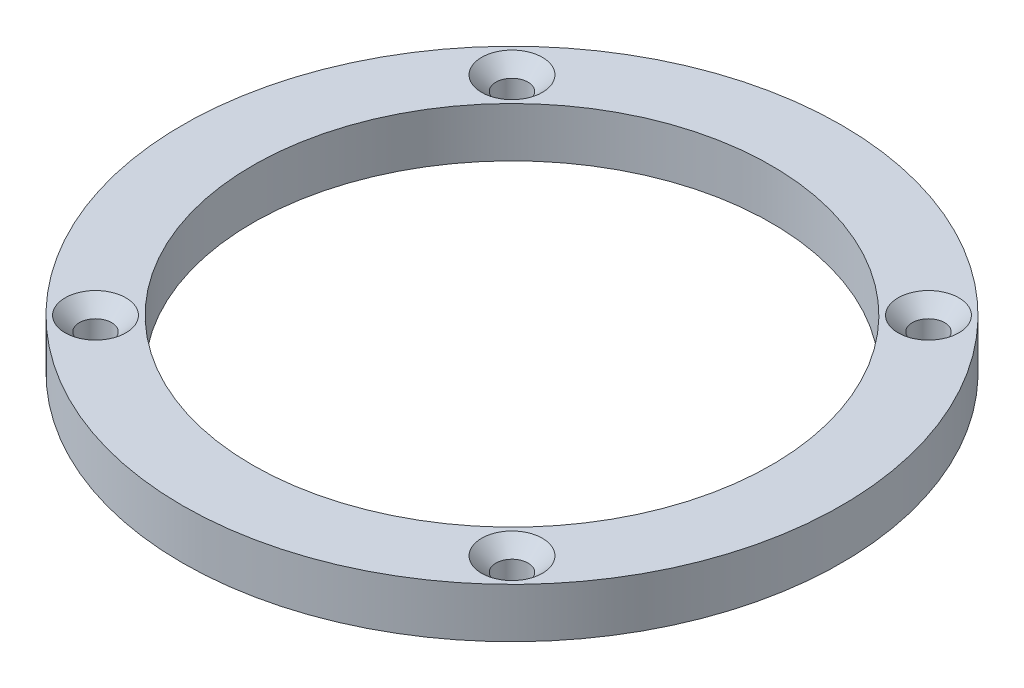
ISO-10303-21;
HEADER;
FILE_DESCRIPTION(('STEP AP214'),'2;1');
FILE_NAME('part.step','',(''),(''),'','','');
FILE_SCHEMA(('AUTOMOTIVE_DESIGN { 1 0 10303 214 1 1 1 1 }'));
ENDSEC;
DATA;
#1=APPLICATION_CONTEXT('core data for automotive mechanical design processes');
#2=APPLICATION_PROTOCOL_DEFINITION('international standard','automotive_design',2000,#1);
#3=PRODUCT_CONTEXT('',#1,'mechanical');
#4=PRODUCT('Part','Part','',(#3));
#5=PRODUCT_RELATED_PRODUCT_CATEGORY('part','',(#4));
#6=PRODUCT_DEFINITION_FORMATION('','',#4);
#7=PRODUCT_DEFINITION_CONTEXT('part definition',#1,'design');
#8=PRODUCT_DEFINITION('design','',#6,#7);
#9=PRODUCT_DEFINITION_SHAPE('','',#8);
#10=(LENGTH_UNIT() NAMED_UNIT(*) SI_UNIT(.MILLI.,.METRE.));
#11=(NAMED_UNIT(*) PLANE_ANGLE_UNIT() SI_UNIT($,.RADIAN.));
#12=(NAMED_UNIT(*) SI_UNIT($,.STERADIAN.) SOLID_ANGLE_UNIT());
#13=UNCERTAINTY_MEASURE_WITH_UNIT(LENGTH_MEASURE(1.E-05),#10,'distance_accuracy_value','');
#14=(GEOMETRIC_REPRESENTATION_CONTEXT(3) GLOBAL_UNCERTAINTY_ASSIGNED_CONTEXT((#13)) GLOBAL_UNIT_ASSIGNED_CONTEXT((#10,
#11,#12)) REPRESENTATION_CONTEXT('',''));
#15=CARTESIAN_POINT('',(0.,0.,0.));
#16=DIRECTION('',(0.,0.,1.));
#17=DIRECTION('',(1.,0.,0.));
#18=AXIS2_PLACEMENT_3D('',#15,#16,#17);
#19=CARTESIAN_POINT('',(0.,8.5,0.));
#20=DIRECTION('',(0.,1.,0.));
#21=DIRECTION('',(0.,0.,1.));
#22=AXIS2_PLACEMENT_3D('',#19,#20,#21);
#23=PLANE('',#22);
#24=CARTESIAN_POINT('',(35.6381817718021,8.5,-35.6381817718019));
#25=DIRECTION('',(0.,1.,0.));
#26=DIRECTION('',(0.,0.,1.));
#27=AXIS2_PLACEMENT_3D('',#24,#25,#26);
#28=CIRCLE('',#27,5.2);
#29=CARTESIAN_POINT('',(35.6381817718021,8.5,-30.4381817718019));
#30=VERTEX_POINT('',#29);
#31=EDGE_CURVE('E120',#30,#30,#28,.T.);
#32=ORIENTED_EDGE('',*,*,#31,.F.);
#33=EDGE_LOOP('',(#32));
#34=FACE_BOUND('',#33,.T.);
#35=CARTESIAN_POINT('',(35.638181771804,8.5,35.638181771802));
#36=DIRECTION('',(0.,1.,0.));
#37=DIRECTION('',(0.,0.,1.));
#38=AXIS2_PLACEMENT_3D('',#35,#36,#37);
#39=CIRCLE('',#38,5.2);
#40=CARTESIAN_POINT('',(35.638181771804,8.5,40.838181771802));
#41=VERTEX_POINT('',#40);
#42=EDGE_CURVE('E77',#41,#41,#39,.T.);
#43=ORIENTED_EDGE('',*,*,#42,.F.);
#44=EDGE_LOOP('',(#43));
#45=FACE_BOUND('',#44,.T.);
#46=CARTESIAN_POINT('',(-35.6381817718,8.5,35.638181771804));
#47=DIRECTION('',(0.,1.,0.));
#48=DIRECTION('',(0.,0.,1.));
#49=AXIS2_PLACEMENT_3D('',#46,#47,#48);
#50=CIRCLE('',#49,5.2);
#51=CARTESIAN_POINT('',(-35.6381817718,8.5,40.838181771804));
#52=VERTEX_POINT('',#51);
#53=EDGE_CURVE('E70',#52,#52,#50,.T.);
#54=ORIENTED_EDGE('',*,*,#53,.F.);
#55=EDGE_LOOP('',(#54));
#56=FACE_BOUND('',#55,.T.);
#57=CARTESIAN_POINT('',(-35.638181771802,8.5,-35.6381817718));
#58=DIRECTION('',(0.,1.,0.));
#59=DIRECTION('',(0.,0.,1.));
#60=AXIS2_PLACEMENT_3D('',#57,#58,#59);
#61=CIRCLE('',#60,5.2);
#62=CARTESIAN_POINT('',(-35.638181771802,8.5,-30.4381817718));
#63=VERTEX_POINT('',#62);
#64=EDGE_CURVE('E66',#63,#63,#61,.T.);
#65=ORIENTED_EDGE('',*,*,#64,.F.);
#66=EDGE_LOOP('',(#65));
#67=FACE_BOUND('',#66,.T.);
#68=CARTESIAN_POINT('',(0.,8.5,0.));
#69=DIRECTION('',(0.,1.,0.));
#70=DIRECTION('',(0.,0.,1.));
#71=AXIS2_PLACEMENT_3D('',#68,#69,#70);
#72=CIRCLE('',#71,56.4);
#73=CARTESIAN_POINT('',(0.,8.5,56.4));
#74=VERTEX_POINT('',#73);
#75=EDGE_CURVE('E10',#74,#74,#72,.T.);
#76=ORIENTED_EDGE('',*,*,#75,.T.);
#77=EDGE_LOOP('',(#76));
#78=FACE_BOUND('',#77,.T.);
#79=CARTESIAN_POINT('',(0.,8.5,0.));
#80=DIRECTION('',(0.,1.,0.));
#81=DIRECTION('',(0.,0.,1.));
#82=AXIS2_PLACEMENT_3D('',#79,#80,#81);
#83=CIRCLE('',#82,44.4);
#84=CARTESIAN_POINT('',(0.,8.5,44.4));
#85=VERTEX_POINT('',#84);
#86=EDGE_CURVE('E54',#85,#85,#83,.T.);
#87=ORIENTED_EDGE('',*,*,#86,.F.);
#88=EDGE_LOOP('',(#87));
#89=FACE_BOUND('',#88,.T.);
#90=ADVANCED_FACE('F41',(#34,#45,#56,#67,#78,#89),#23,.T.);
#91=CARTESIAN_POINT('',(0.,0.,0.));
#92=DIRECTION('',(0.,1.,0.));
#93=DIRECTION('',(0.,0.,1.));
#94=AXIS2_PLACEMENT_3D('',#91,#92,#93);
#95=PLANE('',#94);
#96=CARTESIAN_POINT('',(35.6381817718021,0.,-35.6381817718019));
#97=DIRECTION('',(0.,1.,0.));
#98=DIRECTION('',(0.,0.,1.));
#99=AXIS2_PLACEMENT_3D('',#96,#97,#98);
#100=CIRCLE('',#99,2.74999999999999);
#101=CARTESIAN_POINT('',(35.6381817718021,0.,-32.8881817718019));
#102=VERTEX_POINT('',#101);
#103=EDGE_CURVE('E45',#102,#102,#100,.T.);
#104=ORIENTED_EDGE('',*,*,#103,.T.);
#105=EDGE_LOOP('',(#104));
#106=FACE_BOUND('',#105,.T.);
#107=CARTESIAN_POINT('',(35.638181771804,0.,35.638181771802));
#108=DIRECTION('',(0.,1.,0.));
#109=DIRECTION('',(0.,0.,1.));
#110=AXIS2_PLACEMENT_3D('',#107,#108,#109);
#111=CIRCLE('',#110,2.74999999999999);
#112=CARTESIAN_POINT('',(35.638181771804,0.,38.388181771802));
#113=VERTEX_POINT('',#112);
#114=EDGE_CURVE('E68',#113,#113,#111,.T.);
#115=ORIENTED_EDGE('',*,*,#114,.T.);
#116=EDGE_LOOP('',(#115));
#117=FACE_BOUND('',#116,.T.);
#118=CARTESIAN_POINT('',(-35.6381817718,0.,35.638181771804));
#119=DIRECTION('',(0.,1.,0.));
#120=DIRECTION('',(0.,0.,1.));
#121=AXIS2_PLACEMENT_3D('',#118,#119,#120);
#122=CIRCLE('',#121,2.74999999999999);
#123=CARTESIAN_POINT('',(-35.6381817718,0.,38.388181771804));
#124=VERTEX_POINT('',#123);
#125=EDGE_CURVE('E64',#124,#124,#122,.T.);
#126=ORIENTED_EDGE('',*,*,#125,.T.);
#127=EDGE_LOOP('',(#126));
#128=FACE_BOUND('',#127,.T.);
#129=CARTESIAN_POINT('',(-35.638181771802,0.,-35.6381817718));
#130=DIRECTION('',(0.,1.,0.));
#131=DIRECTION('',(0.,0.,1.));
#132=AXIS2_PLACEMENT_3D('',#129,#130,#131);
#133=CIRCLE('',#132,2.74999999999999);
#134=CARTESIAN_POINT('',(-35.638181771802,0.,-32.8881817718));
#135=VERTEX_POINT('',#134);
#136=EDGE_CURVE('E60',#135,#135,#133,.T.);
#137=ORIENTED_EDGE('',*,*,#136,.T.);
#138=EDGE_LOOP('',(#137));
#139=FACE_BOUND('',#138,.T.);
#140=CARTESIAN_POINT('',(0.,0.,0.));
#141=DIRECTION('',(0.,1.,0.));
#142=DIRECTION('',(0.,0.,1.));
#143=AXIS2_PLACEMENT_3D('',#140,#141,#142);
#144=CIRCLE('',#143,56.4);
#145=CARTESIAN_POINT('',(0.,0.,56.4));
#146=VERTEX_POINT('',#145);
#147=EDGE_CURVE('E49',#146,#146,#144,.T.);
#148=ORIENTED_EDGE('',*,*,#147,.F.);
#149=EDGE_LOOP('',(#148));
#150=FACE_BOUND('',#149,.T.);
#151=CARTESIAN_POINT('',(0.,0.,0.));
#152=DIRECTION('',(0.,1.,0.));
#153=DIRECTION('',(0.,0.,1.));
#154=AXIS2_PLACEMENT_3D('',#151,#152,#153);
#155=CIRCLE('',#154,44.4);
#156=CARTESIAN_POINT('',(0.,0.,44.4));
#157=VERTEX_POINT('',#156);
#158=EDGE_CURVE('E57',#157,#157,#155,.T.);
#159=ORIENTED_EDGE('',*,*,#158,.T.);
#160=EDGE_LOOP('',(#159));
#161=FACE_BOUND('',#160,.T.);
#162=ADVANCED_FACE('F96',(#106,#117,#128,#139,#150,#161),#95,.F.);
#163=CARTESIAN_POINT('',(0.,8.5,0.));
#164=DIRECTION('',(0.,-1.,0.));
#165=DIRECTION('',(0.,0.,-1.));
#166=AXIS2_PLACEMENT_3D('',#163,#164,#165);
#167=CYLINDRICAL_SURFACE('',#166,56.4);
#168=ORIENTED_EDGE('',*,*,#75,.F.);
#169=EDGE_LOOP('',(#168));
#170=FACE_BOUND('',#169,.T.);
#171=ORIENTED_EDGE('',*,*,#147,.T.);
#172=EDGE_LOOP('',(#171));
#173=FACE_BOUND('',#172,.T.);
#174=ADVANCED_FACE('F43',(#170,#173),#167,.T.);
#175=CARTESIAN_POINT('',(0.,8.5,0.));
#176=DIRECTION('',(0.,-1.,0.));
#177=DIRECTION('',(0.,0.,-1.));
#178=AXIS2_PLACEMENT_3D('',#175,#176,#177);
#179=CYLINDRICAL_SURFACE('',#178,44.4);
#180=ORIENTED_EDGE('',*,*,#86,.T.);
#181=EDGE_LOOP('',(#180));
#182=FACE_BOUND('',#181,.T.);
#183=ORIENTED_EDGE('',*,*,#158,.F.);
#184=EDGE_LOOP('',(#183));
#185=FACE_BOUND('',#184,.T.);
#186=ADVANCED_FACE('F98',(#182,#185),#179,.F.);
#187=CARTESIAN_POINT('',(-35.638181771802,8.5,-35.6381817718));
#188=DIRECTION('',(0.,1.,0.));
#189=DIRECTION('',(0.,0.,1.));
#190=AXIS2_PLACEMENT_3D('',#187,#188,#189);
#191=CYLINDRICAL_SURFACE('',#190,2.74999999999999);
#192=CARTESIAN_POINT('',(-35.638181771802,6.05,-35.6381817718));
#193=DIRECTION('',(0.,1.,0.));
#194=DIRECTION('',(0.,0.,1.));
#195=AXIS2_PLACEMENT_3D('',#192,#193,#194);
#196=CIRCLE('',#195,2.75);
#197=CARTESIAN_POINT('',(-35.638181771802,6.05,-32.8881817718));
#198=VERTEX_POINT('',#197);
#199=EDGE_CURVE('E63',#198,#198,#196,.T.);
#200=ORIENTED_EDGE('',*,*,#199,.T.);
#201=EDGE_LOOP('',(#200));
#202=FACE_BOUND('',#201,.T.);
#203=ORIENTED_EDGE('',*,*,#136,.F.);
#204=EDGE_LOOP('',(#203));
#205=FACE_BOUND('',#204,.T.);
#206=ADVANCED_FACE('F100',(#202,#205),#191,.F.);
#207=CARTESIAN_POINT('',(-35.638181771802,8.5,-35.6381817718));
#208=DIRECTION('',(0.,1.,0.));
#209=DIRECTION('',(0.,0.,1.));
#210=AXIS2_PLACEMENT_3D('',#207,#208,#209);
#211=CONICAL_SURFACE('',#210,5.2,0.785398163397449);
#212=ORIENTED_EDGE('',*,*,#199,.F.);
#213=EDGE_LOOP('',(#212));
#214=FACE_BOUND('',#213,.T.);
#215=ORIENTED_EDGE('',*,*,#64,.T.);
#216=EDGE_LOOP('',(#215));
#217=FACE_BOUND('',#216,.T.);
#218=ADVANCED_FACE('F107',(#214,#217),#211,.F.);
#219=CARTESIAN_POINT('',(-35.6381817718,8.5,35.638181771804));
#220=DIRECTION('',(0.,1.,0.));
#221=DIRECTION('',(0.,0.,1.));
#222=AXIS2_PLACEMENT_3D('',#219,#220,#221);
#223=CYLINDRICAL_SURFACE('',#222,2.74999999999999);
#224=CARTESIAN_POINT('',(-35.6381817718,6.05,35.638181771804));
#225=DIRECTION('',(0.,1.,0.));
#226=DIRECTION('',(0.,0.,1.));
#227=AXIS2_PLACEMENT_3D('',#224,#225,#226);
#228=CIRCLE('',#227,2.75);
#229=CARTESIAN_POINT('',(-35.6381817718,6.05,38.388181771804));
#230=VERTEX_POINT('',#229);
#231=EDGE_CURVE('E67',#230,#230,#228,.T.);
#232=ORIENTED_EDGE('',*,*,#231,.T.);
#233=EDGE_LOOP('',(#232));
#234=FACE_BOUND('',#233,.T.);
#235=ORIENTED_EDGE('',*,*,#125,.F.);
#236=EDGE_LOOP('',(#235));
#237=FACE_BOUND('',#236,.T.);
#238=ADVANCED_FACE('F129',(#234,#237),#223,.F.);
#239=CARTESIAN_POINT('',(-35.6381817718,8.5,35.638181771804));
#240=DIRECTION('',(0.,1.,0.));
#241=DIRECTION('',(0.,0.,1.));
#242=AXIS2_PLACEMENT_3D('',#239,#240,#241);
#243=CONICAL_SURFACE('',#242,5.2,0.785398163397449);
#244=ORIENTED_EDGE('',*,*,#231,.F.);
#245=EDGE_LOOP('',(#244));
#246=FACE_BOUND('',#245,.T.);
#247=ORIENTED_EDGE('',*,*,#53,.T.);
#248=EDGE_LOOP('',(#247));
#249=FACE_BOUND('',#248,.T.);
#250=ADVANCED_FACE('F135',(#246,#249),#243,.F.);
#251=CARTESIAN_POINT('',(35.638181771804,8.5,35.638181771802));
#252=DIRECTION('',(0.,1.,0.));
#253=DIRECTION('',(0.,0.,1.));
#254=AXIS2_PLACEMENT_3D('',#251,#252,#253);
#255=CYLINDRICAL_SURFACE('',#254,2.74999999999999);
#256=CARTESIAN_POINT('',(35.638181771804,6.05,35.638181771802));
#257=DIRECTION('',(0.,1.,0.));
#258=DIRECTION('',(0.,0.,1.));
#259=AXIS2_PLACEMENT_3D('',#256,#257,#258);
#260=CIRCLE('',#259,2.75);
#261=CARTESIAN_POINT('',(35.638181771804,6.05,38.388181771802));
#262=VERTEX_POINT('',#261);
#263=EDGE_CURVE('E71',#262,#262,#260,.T.);
#264=ORIENTED_EDGE('',*,*,#263,.T.);
#265=EDGE_LOOP('',(#264));
#266=FACE_BOUND('',#265,.T.);
#267=ORIENTED_EDGE('',*,*,#114,.F.);
#268=EDGE_LOOP('',(#267));
#269=FACE_BOUND('',#268,.T.);
#270=ADVANCED_FACE('F142',(#266,#269),#255,.F.);
#271=CARTESIAN_POINT('',(35.638181771804,8.5,35.638181771802));
#272=DIRECTION('',(0.,1.,0.));
#273=DIRECTION('',(0.,0.,1.));
#274=AXIS2_PLACEMENT_3D('',#271,#272,#273);
#275=CONICAL_SURFACE('',#274,5.2,0.785398163397448);
#276=ORIENTED_EDGE('',*,*,#263,.F.);
#277=EDGE_LOOP('',(#276));
#278=FACE_BOUND('',#277,.T.);
#279=ORIENTED_EDGE('',*,*,#42,.T.);
#280=EDGE_LOOP('',(#279));
#281=FACE_BOUND('',#280,.T.);
#282=ADVANCED_FACE('F146',(#278,#281),#275,.F.);
#283=CARTESIAN_POINT('',(35.6381817718021,8.5,-35.6381817718019));
#284=DIRECTION('',(0.,1.,0.));
#285=DIRECTION('',(0.,0.,1.));
#286=AXIS2_PLACEMENT_3D('',#283,#284,#285);
#287=CYLINDRICAL_SURFACE('',#286,2.74999999999999);
#288=CARTESIAN_POINT('',(35.6381817718021,6.05,-35.6381817718019));
#289=DIRECTION('',(0.,1.,0.));
#290=DIRECTION('',(0.,0.,1.));
#291=AXIS2_PLACEMENT_3D('',#288,#289,#290);
#292=CIRCLE('',#291,2.75);
#293=CARTESIAN_POINT('',(35.6381817718021,6.05,-32.8881817718019));
#294=VERTEX_POINT('',#293);
#295=EDGE_CURVE('E162',#294,#294,#292,.T.);
#296=ORIENTED_EDGE('',*,*,#295,.T.);
#297=EDGE_LOOP('',(#296));
#298=FACE_BOUND('',#297,.T.);
#299=ORIENTED_EDGE('',*,*,#103,.F.);
#300=EDGE_LOOP('',(#299));
#301=FACE_BOUND('',#300,.T.);
#302=ADVANCED_FACE('F149',(#298,#301),#287,.F.);
#303=CARTESIAN_POINT('',(35.6381817718021,8.5,-35.6381817718019));
#304=DIRECTION('',(0.,1.,0.));
#305=DIRECTION('',(0.,0.,1.));
#306=AXIS2_PLACEMENT_3D('',#303,#304,#305);
#307=CONICAL_SURFACE('',#306,5.2,0.785398163397448);
#308=ORIENTED_EDGE('',*,*,#295,.F.);
#309=EDGE_LOOP('',(#308));
#310=FACE_BOUND('',#309,.T.);
#311=ORIENTED_EDGE('',*,*,#31,.T.);
#312=EDGE_LOOP('',(#311));
#313=FACE_BOUND('',#312,.T.);
#314=ADVANCED_FACE('F153',(#310,#313),#307,.F.);
#315=CLOSED_SHELL('',(#90,#162,#174,#186,#206,#218,#238,#250,#270,#282,#302,#314));
#316=MANIFOLD_SOLID_BREP('B2',#315);
#317=ADVANCED_BREP_SHAPE_REPRESENTATION('',(#18,#316),#14);
#318=SHAPE_DEFINITION_REPRESENTATION(#9,#317);
ENDSEC;
END-ISO-10303-21;
